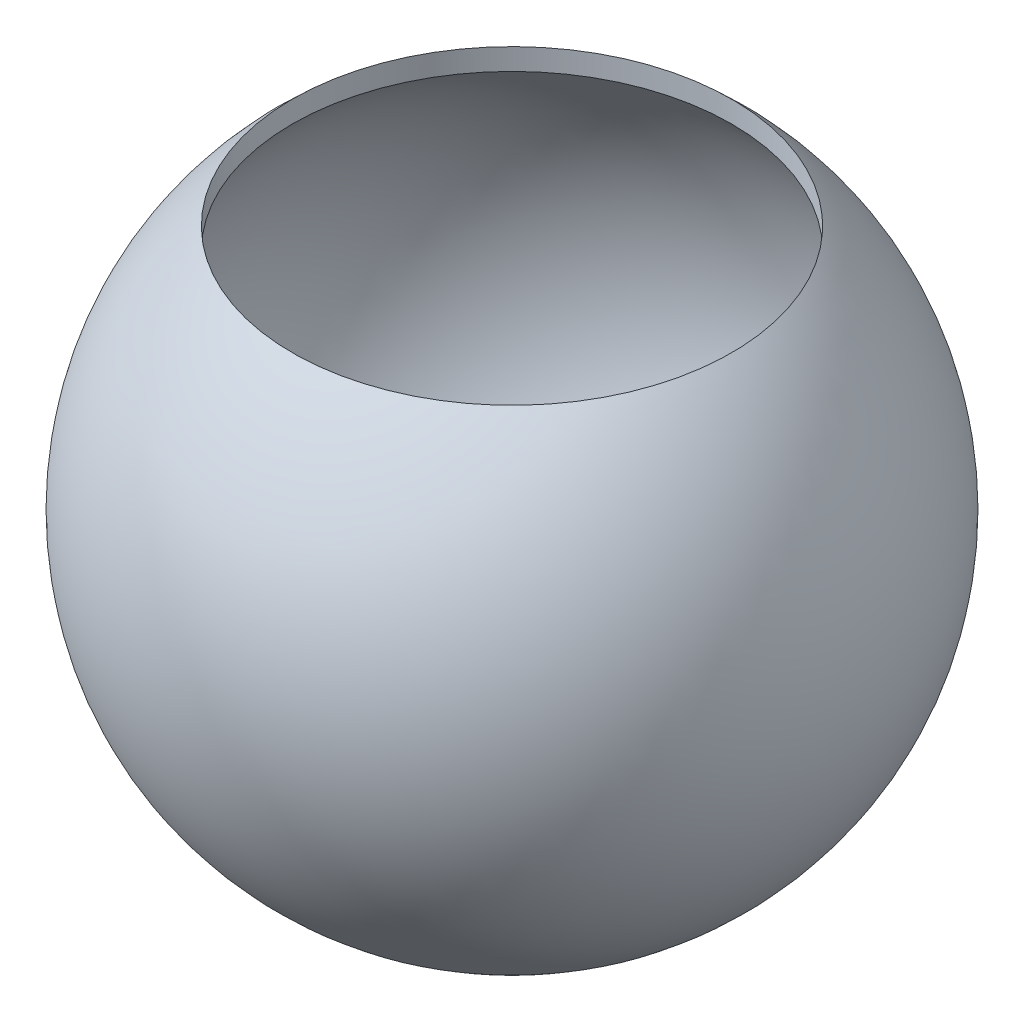
ISO-10303-21;
HEADER;
FILE_DESCRIPTION(('STEP AP214'),'2;1');
FILE_NAME('part.step','',(''),(''),'','','');
FILE_SCHEMA(('AUTOMOTIVE_DESIGN { 1 0 10303 214 1 1 1 1 }'));
ENDSEC;
DATA;
#1=APPLICATION_CONTEXT('core data for automotive mechanical design processes');
#2=APPLICATION_PROTOCOL_DEFINITION('international standard','automotive_design',2000,#1);
#3=PRODUCT_CONTEXT('',#1,'mechanical');
#4=PRODUCT('Part','Part','',(#3));
#5=PRODUCT_RELATED_PRODUCT_CATEGORY('part','',(#4));
#6=PRODUCT_DEFINITION_FORMATION('','',#4);
#7=PRODUCT_DEFINITION_CONTEXT('part definition',#1,'design');
#8=PRODUCT_DEFINITION('design','',#6,#7);
#9=PRODUCT_DEFINITION_SHAPE('','',#8);
#10=(LENGTH_UNIT() NAMED_UNIT(*) SI_UNIT(.MILLI.,.METRE.));
#11=(NAMED_UNIT(*) PLANE_ANGLE_UNIT() SI_UNIT($,.RADIAN.));
#12=(NAMED_UNIT(*) SI_UNIT($,.STERADIAN.) SOLID_ANGLE_UNIT());
#13=UNCERTAINTY_MEASURE_WITH_UNIT(LENGTH_MEASURE(1.E-05),#10,'distance_accuracy_value','');
#14=(GEOMETRIC_REPRESENTATION_CONTEXT(3) GLOBAL_UNCERTAINTY_ASSIGNED_CONTEXT((#13)) GLOBAL_UNIT_ASSIGNED_CONTEXT((#10,
#11,#12)) REPRESENTATION_CONTEXT('',''));
#15=CARTESIAN_POINT('',(0.,0.,0.));
#16=DIRECTION('',(0.,0.,1.));
#17=DIRECTION('',(1.,0.,0.));
#18=AXIS2_PLACEMENT_3D('',#15,#16,#17);
#19=CARTESIAN_POINT('',(0.,0.,0.));
#20=DIRECTION('',(0.,-1.,0.));
#21=DIRECTION('',(1.,0.,0.));
#22=AXIS2_PLACEMENT_3D('',#19,#20,#21);
#23=SPHERICAL_SURFACE('',#22,10.);
#24=CARTESIAN_POINT('',(0.,7.14142842854285,0.));
#25=DIRECTION('',(0.,-1.,0.));
#26=DIRECTION('',(0.,0.,-1.));
#27=AXIS2_PLACEMENT_3D('',#24,#25,#26);
#28=CIRCLE('',#27,7.);
#29=CARTESIAN_POINT('',(7.,7.14142842854285,0.));
#30=VERTEX_POINT('',#29);
#31=EDGE_CURVE('E44',#30,#30,#28,.T.);
#32=CARTESIAN_POINT('',(0.,-9.68245836551854,0.));
#33=DIRECTION('',(0.,1.,0.));
#34=DIRECTION('',(0.,0.,1.));
#35=AXIS2_PLACEMENT_3D('',#32,#33,#34);
#36=CIRCLE('',#35,2.5);
#37=CARTESIAN_POINT('',(2.5,-9.68245836551854,0.));
#38=VERTEX_POINT('',#37);
#39=EDGE_CURVE('E39',#38,#38,#36,.F.);
#40=CARTESIAN_POINT('',(7.,7.14142842854285,0.));
#41=CARTESIAN_POINT('',(7.15723259427202,6.98732557307647,0.));
#42=CARTESIAN_POINT('',(7.30935933636643,6.82801556646081,0.));
#43=CARTESIAN_POINT('',(7.60277501516106,6.49970926120552,0.));
#44=CARTESIAN_POINT('',(7.74406395186128,6.33071296256588,0.));
#45=CARTESIAN_POINT('',(8.01517791882855,5.98376208353724,0.));
#46=CARTESIAN_POINT('',(8.1450029490956,5.80580750314823,0.));
#47=CARTESIAN_POINT('',(8.39262565571196,5.44171845278763,0.));
#48=CARTESIAN_POINT('',(8.51042333206127,5.25558398281603,0.));
#49=CARTESIAN_POINT('',(8.7334769375083,4.87594618261991,0.));
#50=CARTESIAN_POINT('',(8.83873286660601,4.68244285239537,0.));
#51=CARTESIAN_POINT('',(9.03624418376611,4.2889113067419,0.));
#52=CARTESIAN_POINT('',(9.12849957182848,4.08888309131297,0.));
#53=CARTESIAN_POINT('',(9.2996074605322,3.68317398541121,0.));
#54=CARTESIAN_POINT('',(9.37845996117355,3.4774930949384,0.));
#55=CARTESIAN_POINT('',(9.52241823943702,3.06137555687624,0.));
#56=CARTESIAN_POINT('',(9.58752401705915,2.85093890928691,0.));
#57=CARTESIAN_POINT('',(9.70370494105843,2.42622749755353,0.));
#58=CARTESIAN_POINT('',(9.75478008743559,2.21195273340948,0.));
#59=CARTESIAN_POINT('',(9.84267702829781,1.78049947006024,0.));
#60=CARTESIAN_POINT('',(9.87949882278288,1.56332097085506,0.));
#61=CARTESIAN_POINT('',(9.93872849206036,1.12700727997258,0.));
#62=CARTESIAN_POINT('',(9.96113636685277,0.907872088295296,0.));
#63=CARTESIAN_POINT('',(9.99144048356564,0.468600587840073,0.));
#64=CARTESIAN_POINT('',(9.99933672548611,0.248464279062139,0.));
#65=CARTESIAN_POINT('',(10.000583143565,-0.19184951476652,0.));
#66=CARTESIAN_POINT('',(9.99393331972334,-0.412026999817245,0.));
#67=CARTESIAN_POINT('',(9.9661166039417,-0.851463025786085,0.));
#68=CARTESIAN_POINT('',(9.94494971200166,-1.0707215667042,0.));
#69=CARTESIAN_POINT('',(9.88819116176087,-1.50736359121633,0.));
#70=CARTESIAN_POINT('',(9.85259950346011,-1.72474707481035,0.));
#71=CARTESIAN_POINT('',(9.76714662382081,-2.15669104797936,0.));
#72=CARTESIAN_POINT('',(9.71728540248227,-2.37125153755436,0.));
#73=CARTESIAN_POINT('',(9.60351082488355,-2.79661389612391,0.));
#74=CARTESIAN_POINT('',(9.53959746862338,-3.00741576511846,0.));
#75=CARTESIAN_POINT('',(9.3979973259601,-3.42434164605346,0.));
#76=CARTESIAN_POINT('',(9.32031053955699,-3.63046565799391,0.));
#77=CARTESIAN_POINT('',(9.15150230271034,-4.03713698691717,0.));
#78=CARTESIAN_POINT('',(9.0603808522668,-4.23768430389999,0.));
#79=CARTESIAN_POINT('',(8.86510063752078,-4.63232772310892,0.));
#80=CARTESIAN_POINT('',(8.76094187321832,-4.82642382533503,0.));
#81=CARTESIAN_POINT('',(8.54004123230027,-5.20731842681398,0.));
#82=CARTESIAN_POINT('',(8.42329935568468,-5.39411692606682,0.));
#83=CARTESIAN_POINT('',(8.17774156244226,-5.75960175582018,0.));
#84=CARTESIAN_POINT('',(8.04892564581542,-5.9382880863207,0.));
#85=CARTESIAN_POINT('',(7.77978149566627,-6.28676938713137,0.));
#86=CARTESIAN_POINT('',(7.63945326214396,-6.45656435744152,0.));
#87=CARTESIAN_POINT('',(7.34789640282614,-6.78652251911111,0.));
#88=CARTESIAN_POINT('',(7.19666777703064,-6.94668571047055,0.));
#89=CARTESIAN_POINT('',(6.88396959022735,-7.25668189484679,0.));
#90=CARTESIAN_POINT('',(6.72250002921957,-7.40651488786359,0.));
#91=CARTESIAN_POINT('',(6.39002408831695,-7.69519730867303,0.));
#92=CARTESIAN_POINT('',(6.2190177084221,-7.83404673646568,0.));
#93=CARTESIAN_POINT('',(5.86821382559839,-8.10015653332414,0.));
#94=CARTESIAN_POINT('',(5.68841632266953,-8.22741690238997,0.));
#95=CARTESIAN_POINT('',(5.32081425221322,-8.46979370744144,0.));
#96=CARTESIAN_POINT('',(5.13300968468577,-8.58491014342708,0.));
#97=CARTESIAN_POINT('',(4.75021235721459,-8.80249685331901,0.));
#98=CARTESIAN_POINT('',(4.55521959727087,-8.90496712722531,0.));
#99=CARTESIAN_POINT('',(4.15889648455877,-9.09681558761707,0.));
#100=CARTESIAN_POINT('',(3.95756613179039,-9.18619377410254,0.));
#101=CARTESIAN_POINT('',(3.54944464310737,-9.35146490291406,0.));
#102=CARTESIAN_POINT('',(3.34265350719273,-9.42735784524011,0.));
#103=CARTESIAN_POINT('',(2.92451639658662,-9.56534026211584,0.));
#104=CARTESIAN_POINT('',(2.71317042189515,-9.62742973666552,0.));
#105=CARTESIAN_POINT('',(2.5,-9.68245836551854,0.));
#106=B_SPLINE_CURVE_WITH_KNOTS('',3,(#40,#41,#42,#43,#44,#45,#46,#47,#48,#49,#50,#51,#52,#53,
#54,#55,#56,#57,#58,#59,#60,#61,#62,#63,#64,#65,#66,#67,#68,#69,#70,#71,#72,#73,#74,#75,#76,#77,
#78,#79,#80,#81,#82,#83,#84,#85,#86,#87,#88,#89,#90,#91,#92,#93,#94,#95,#96,#97,#98,#99,#100,
#101,#102,#103,#104,#105),.UNSPECIFIED.,.F.,.F.,(4,2,2,2,2,2,2,2,2,2,2,2,2,2,2,2,2,2,2,2,2,2,2,
2,2,2,2,2,2,2,2,2,4),(0.,0.660353365414917,1.32070673082984,1.98106009624475,2.64141346165967,
3.30176682707459,3.96212019248951,4.62247355790443,5.28282692331934,5.94318028873426,
6.60353365414918,7.2638870195641,7.92424038497902,8.58459375039393,9.24494711580885,
9.90530048122377,10.5656538466387,11.2260072120536,11.8863605774685,12.5467139428834,
13.2070673082984,13.8674206737133,14.5277740391282,15.1881274045431,15.848480769958,
16.508834135373,17.1691875007879,17.8295408662028,18.4898942316177,19.1502475970326,
19.8106009624475,20.4709543278625,21.1313076932774),.UNSPECIFIED.);
#107=EDGE_CURVE('BSEAM36',#30,#38,#106,.T.);
#108=ORIENTED_EDGE('',*,*,#31,.F.);
#109=ORIENTED_EDGE('',*,*,#39,.T.);
#110=ORIENTED_EDGE('',*,*,#107,.T.);
#111=ORIENTED_EDGE('',*,*,#107,.F.);
#112=EDGE_LOOP('',(#108,#110,#109,#111));
#113=FACE_BOUND('',#112,.T.);
#114=ADVANCED_FACE('F36',(#113),#23,.F.);
#115=CARTESIAN_POINT('',(0.,0.5,0.));
#116=DIRECTION('',(0.,1.,0.));
#117=DIRECTION('',(0.,0.,1.));
#118=AXIS2_PLACEMENT_3D('',#115,#116,#117);
#119=CYLINDRICAL_SURFACE('',#118,7.);
#120=CARTESIAN_POINT('',(0.,7.82623792124926,0.));
#121=DIRECTION('',(0.,-1.,0.));
#122=DIRECTION('',(0.,0.,-1.));
#123=AXIS2_PLACEMENT_3D('',#120,#121,#122);
#124=CIRCLE('',#123,7.);
#125=CARTESIAN_POINT('',(-7.,7.82623792124927,0.));
#126=VERTEX_POINT('',#125);
#127=EDGE_CURVE('E10',#126,#126,#124,.F.);
#128=ORIENTED_EDGE('',*,*,#127,.T.);
#129=EDGE_LOOP('',(#128));
#130=FACE_BOUND('',#129,.T.);
#131=ORIENTED_EDGE('',*,*,#31,.T.);
#132=EDGE_LOOP('',(#131));
#133=FACE_BOUND('',#132,.T.);
#134=ADVANCED_FACE('F69',(#130,#133),#119,.F.);
#135=CARTESIAN_POINT('',(0.,0.,0.));
#136=DIRECTION('',(0.,-1.,0.));
#137=DIRECTION('',(-1.,0.,0.));
#138=AXIS2_PLACEMENT_3D('',#135,#136,#137);
#139=SPHERICAL_SURFACE('',#138,10.5);
#140=CARTESIAN_POINT('',(0.,-10.1980390271856,0.));
#141=DIRECTION('',(0.,1.,0.));
#142=DIRECTION('',(0.,0.,1.));
#143=AXIS2_PLACEMENT_3D('',#140,#141,#142);
#144=CIRCLE('',#143,2.5);
#145=CARTESIAN_POINT('',(-2.5,-10.1980390271856,0.));
#146=VERTEX_POINT('',#145);
#147=EDGE_CURVE('E51',#146,#146,#144,.F.);
#148=CARTESIAN_POINT('',(-2.5,-10.1980390271856,0.));
#149=CARTESIAN_POINT('',(-2.73067736774025,-10.1415032733364,0.));
#150=CARTESIAN_POINT('',(-2.95942835962867,-10.07711598999,0.));
#151=CARTESIAN_POINT('',(-3.41204240403614,-9.93299046419368,0.));
#152=CARTESIAN_POINT('',(-3.63590545655519,-9.8532522217437,0.));
#153=CARTESIAN_POINT('',(-4.07770843455822,-9.67877687763106,0.));
#154=CARTESIAN_POINT('',(-4.2956483600422,-9.58403977596839,0.));
#155=CARTESIAN_POINT('',(-4.72460318882493,-9.38000678575362,0.));
#156=CARTESIAN_POINT('',(-4.93561809212367,-9.27071089720152,0.));
#157=CARTESIAN_POINT('',(-5.3497512416426,-9.03806234591939,0.));
#158=CARTESIAN_POINT('',(-5.55286948786279,-8.91470968318936,0.));
#159=CARTESIAN_POINT('',(-5.95027446917495,-8.65451565840343,0.));
#160=CARTESIAN_POINT('',(-6.14456120426691,-8.51767429634752,0.));
#161=CARTESIAN_POINT('',(-6.52340884440359,-8.23113267149311,0.));
#162=CARTESIAN_POINT('',(-6.7079697494483,-8.0814324086946,0.));
#163=CARTESIAN_POINT('',(-7.06651620927113,-7.76986206756321,0.));
#164=CARTESIAN_POINT('',(-7.24050176404925,-7.60799198923033,0.));
#165=CARTESIAN_POINT('',(-7.57709667272556,-7.27282709328287,0.));
#166=CARTESIAN_POINT('',(-7.73970602662374,-7.0995322756683,0.));
#167=CARTESIAN_POINT('',(-8.0528000493755,-6.74231557205519,0.));
#168=CARTESIAN_POINT('',(-8.20328471822906,-6.55839368605665,0.));
#169=CARTESIAN_POINT('',(-8.49143669559055,-6.18076943068508,0.));
#170=CARTESIAN_POINT('',(-8.62910400409847,-5.98706706131205,0.));
#171=CARTESIAN_POINT('',(-8.89098758344723,-5.5907734438949,0.));
#172=CARTESIAN_POINT('',(-9.01520385428807,-5.38818219585078,0.));
#173=CARTESIAN_POINT('',(-9.24961359555019,-4.97504334082861,0.));
#174=CARTESIAN_POINT('',(-9.35980706597148,-4.76449573385055,0.));
#175=CARTESIAN_POINT('',(-9.56566399006748,-4.33641330354959,0.));
#176=CARTESIAN_POINT('',(-9.6613274437422,-4.11887848022669,0.));
#177=CARTESIAN_POINT('',(-9.83768399912627,-3.67782292170505,0.));
#178=CARTESIAN_POINT('',(-9.91837710083563,-3.45430218650631,0.));
#179=CARTESIAN_POINT('',(-10.0644215250285,-3.00230366162798,0.));
#180=CARTESIAN_POINT('',(-10.129772847512,-2.77382587194838,0.));
#181=CARTESIAN_POINT('',(-10.2448329036155,-2.31296491263483,0.));
#182=CARTESIAN_POINT('',(-10.2945416372354,-2.08058174300088,0.));
#183=CARTESIAN_POINT('',(-10.3780877082123,-1.6129796746197,0.));
#184=CARTESIAN_POINT('',(-10.4119250455692,-1.37776077587248,0.));
#185=CARTESIAN_POINT('',(-10.4635725720501,-0.905569952858972,0.));
#186=CARTESIAN_POINT('',(-10.4813827611741,-0.668598028592683,0.));
#187=CARTESIAN_POINT('',(-10.5008940115713,-0.193991927242756,0.));
#188=CARTESIAN_POINT('',(-10.5025950728446,0.0436422498408837,0.));
#189=CARTESIAN_POINT('',(-10.4898802376146,0.518479035792316,0.));
#190=CARTESIAN_POINT('',(-10.4754643411114,0.755681644660108,0.));
#191=CARTESIAN_POINT('',(-10.4305819461702,1.22856345966511,0.));
#192=CARTESIAN_POINT('',(-10.4001154477322,1.46424266580233,0.));
#193=CARTESIAN_POINT('',(-10.3232720849684,1.93299285289713,0.));
#194=CARTESIAN_POINT('',(-10.2768952206426,2.16606383385473,0.));
#195=CARTESIAN_POINT('',(-10.1684445973339,2.62852475407075,0.));
#196=CARTESIAN_POINT('',(-10.106370838351,2.85791469332917,0.));
#197=CARTESIAN_POINT('',(-9.96681214775411,3.31195765594523,0.));
#198=CARTESIAN_POINT('',(-9.88932721614015,3.53661067930286,0.));
#199=CARTESIAN_POINT('',(-9.71930284460829,3.98014574489454,0.));
#200=CARTESIAN_POINT('',(-9.6267634046904,4.19902778712859,0.));
#201=CARTESIAN_POINT('',(-9.42705595656235,4.63001336968735,0.));
#202=CARTESIAN_POINT('',(-9.31988794835219,4.84211691001207,0.));
#203=CARTESIAN_POINT('',(-9.09141671169411,5.25856924068864,0.));
#204=CARTESIAN_POINT('',(-8.9701134832462,5.46291803104049,0.));
#205=CARTESIAN_POINT('',(-8.71392994447635,5.86292004154482,0.));
#206=CARTESIAN_POINT('',(-8.57904963415443,6.05857326169729,0.));
#207=CARTESIAN_POINT('',(-8.29633358576167,6.44028433333811,0.));
#208=CARTESIAN_POINT('',(-8.14849784769084,6.62634218482645,0.));
#209=CARTESIAN_POINT('',(-7.84054842094139,6.98800316923071,0.));
#210=CARTESIAN_POINT('',(-7.68043473226277,7.16360630214663,0.));
#211=CARTESIAN_POINT('',(-7.34867761669249,7.50356050001665,0.));
#212=CARTESIAN_POINT('',(-7.17703418980082,7.66791156497075,0.));
#213=CARTESIAN_POINT('',(-7.,7.82623792124927,0.));
#214=B_SPLINE_CURVE_WITH_KNOTS('',3,(#148,#149,#150,#151,#152,#153,#154,#155,#156,#157,#158,
#159,#160,#161,#162,#163,#164,#165,#166,#167,#168,#169,#170,#171,#172,#173,#174,#175,#176,#177,
#178,#179,#180,#181,#182,#183,#184,#185,#186,#187,#188,#189,#190,#191,#192,#193,#194,#195,#196,
#197,#198,#199,#200,#201,#202,#203,#204,#205,#206,#207,#208,#209,#210,#211,#212,#213),
.UNSPECIFIED.,.F.,.F.,(4,2,2,2,2,2,2,2,2,2,2,2,2,2,2,2,2,2,2,2,2,2,2,2,2,2,2,2,2,2,2,2,4),(0.,
0.712373871597388,1.42474774319478,2.13712161479216,2.84949548638955,3.56186935798694,
4.27424322958433,4.98661710118171,5.6989909727791,6.41136484437649,7.12373871597388,
7.83611258757127,8.54848645916865,9.26086033076604,9.97323420236343,10.6856080739608,
11.3979819455582,12.1103558171556,12.822729688753,13.5351035603504,14.2474774319478,
14.9598513035451,15.6722251751425,16.3845990467399,17.0969729183373,17.8093467899347,
18.5217206615321,19.2340945331295,19.9464684047269,20.6588422763242,21.3712161479216,
22.083590019519,22.7959638911164),.UNSPECIFIED.);
#215=EDGE_CURVE('BSEAM63',#146,#126,#214,.T.);
#216=ORIENTED_EDGE('',*,*,#147,.F.);
#217=ORIENTED_EDGE('',*,*,#127,.F.);
#218=ORIENTED_EDGE('',*,*,#215,.T.);
#219=ORIENTED_EDGE('',*,*,#215,.F.);
#220=EDGE_LOOP('',(#216,#218,#217,#219));
#221=FACE_BOUND('',#220,.T.);
#222=ADVANCED_FACE('F63',(#221),#139,.T.);
#223=CARTESIAN_POINT('',(0.,0.0660349724123967,0.));
#224=DIRECTION('',(0.,-1.,0.));
#225=DIRECTION('',(0.,0.,-1.));
#226=AXIS2_PLACEMENT_3D('',#223,#224,#225);
#227=CYLINDRICAL_SURFACE('',#226,2.5);
#228=ORIENTED_EDGE('',*,*,#39,.F.);
#229=EDGE_LOOP('',(#228));
#230=FACE_BOUND('',#229,.T.);
#231=ORIENTED_EDGE('',*,*,#147,.T.);
#232=EDGE_LOOP('',(#231));
#233=FACE_BOUND('',#232,.T.);
#234=ADVANCED_FACE('F61',(#230,#233),#227,.F.);
#235=CLOSED_SHELL('',(#114,#134,#222,#234));
#236=MANIFOLD_SOLID_BREP('B2',#235);
#237=ADVANCED_BREP_SHAPE_REPRESENTATION('',(#18,#236),#14);
#238=SHAPE_DEFINITION_REPRESENTATION(#9,#237);
ENDSEC;
END-ISO-10303-21;
